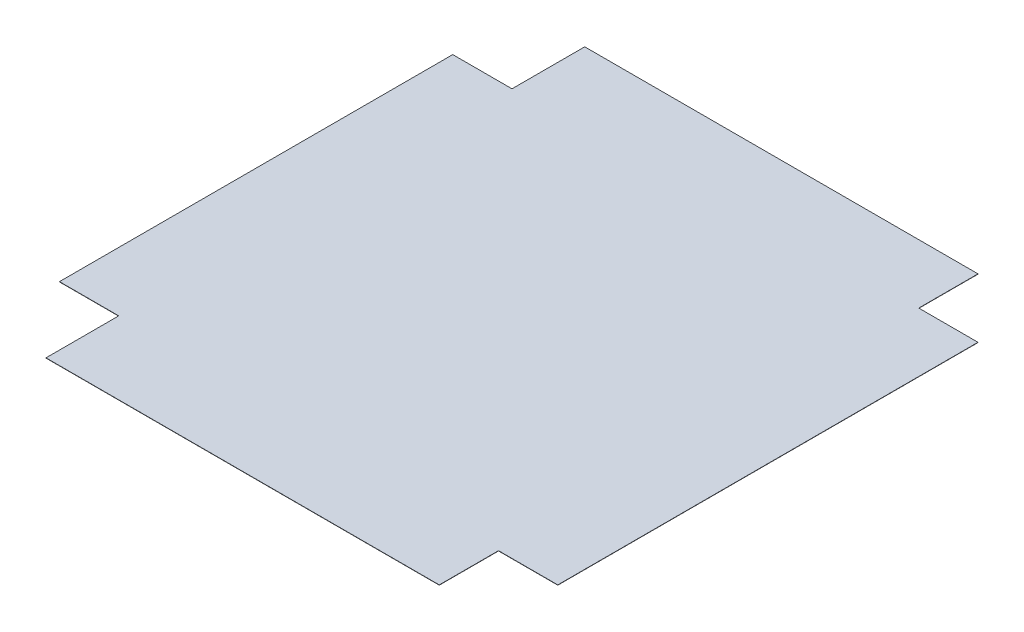
ISO-10303-21;
HEADER;
FILE_DESCRIPTION(('STEP AP214'),'2;1');
FILE_NAME('part.step','',(''),(''),'','','');
FILE_SCHEMA(('AUTOMOTIVE_DESIGN { 1 0 10303 214 1 1 1 1 }'));
ENDSEC;
DATA;
#1=APPLICATION_CONTEXT('core data for automotive mechanical design processes');
#2=APPLICATION_PROTOCOL_DEFINITION('international standard','automotive_design',2000,#1);
#3=PRODUCT_CONTEXT('',#1,'mechanical');
#4=PRODUCT('Part','Part','',(#3));
#5=PRODUCT_RELATED_PRODUCT_CATEGORY('part','',(#4));
#6=PRODUCT_DEFINITION_FORMATION('','',#4);
#7=PRODUCT_DEFINITION_CONTEXT('part definition',#1,'design');
#8=PRODUCT_DEFINITION('design','',#6,#7);
#9=PRODUCT_DEFINITION_SHAPE('','',#8);
#10=(LENGTH_UNIT() NAMED_UNIT(*) SI_UNIT(.MILLI.,.METRE.));
#11=(NAMED_UNIT(*) PLANE_ANGLE_UNIT() SI_UNIT($,.RADIAN.));
#12=(NAMED_UNIT(*) SI_UNIT($,.STERADIAN.) SOLID_ANGLE_UNIT());
#13=UNCERTAINTY_MEASURE_WITH_UNIT(LENGTH_MEASURE(1.E-05),#10,'distance_accuracy_value','');
#14=(GEOMETRIC_REPRESENTATION_CONTEXT(3) GLOBAL_UNCERTAINTY_ASSIGNED_CONTEXT((#13)) GLOBAL_UNIT_ASSIGNED_CONTEXT((#10,
#11,#12)) REPRESENTATION_CONTEXT('',''));
#15=CARTESIAN_POINT('',(0.,0.,0.));
#16=DIRECTION('',(0.,0.,1.));
#17=DIRECTION('',(1.,0.,0.));
#18=AXIS2_PLACEMENT_3D('',#15,#16,#17);
#19=CARTESIAN_POINT('',(-73.,0.05,-73.));
#20=DIRECTION('',(1.,0.,0.));
#21=DIRECTION('',(0.,0.,-1.));
#22=AXIS2_PLACEMENT_3D('',#19,#20,#21);
#23=PLANE('',#22);
#24=DIRECTION('',(0.,0.,1.));
#25=VECTOR('',#24,1.);
#26=CARTESIAN_POINT('',(-73.,-0.05,-73.));
#27=LINE('',#26,#25);
#28=CARTESIAN_POINT('',(-73.,-0.05,-100.));
#29=VERTEX_POINT('',#28);
#30=CARTESIAN_POINT('',(-73.,-0.05,-73.));
#31=VERTEX_POINT('',#30);
#32=EDGE_CURVE('E153',#29,#31,#27,.T.);
#33=ORIENTED_EDGE('',*,*,#32,.T.);
#34=DIRECTION('',(0.,-1.,0.));
#35=VECTOR('',#34,1.);
#36=CARTESIAN_POINT('',(-73.,0.05,-73.));
#37=LINE('',#36,#35);
#38=CARTESIAN_POINT('',(-73.,0.05,-73.));
#39=VERTEX_POINT('',#38);
#40=EDGE_CURVE('E11',#39,#31,#37,.T.);
#41=ORIENTED_EDGE('',*,*,#40,.F.);
#42=DIRECTION('',(0.,0.,1.));
#43=VECTOR('',#42,1.);
#44=CARTESIAN_POINT('',(-73.,0.05,-73.));
#45=LINE('',#44,#43);
#46=CARTESIAN_POINT('',(-73.,0.05,-100.));
#47=VERTEX_POINT('',#46);
#48=EDGE_CURVE('E175',#47,#39,#45,.T.);
#49=ORIENTED_EDGE('',*,*,#48,.F.);
#50=DIRECTION('',(0.,-1.,0.));
#51=VECTOR('',#50,1.);
#52=CARTESIAN_POINT('',(-73.,0.05,-100.));
#53=LINE('',#52,#51);
#54=EDGE_CURVE('E149',#47,#29,#53,.T.);
#55=ORIENTED_EDGE('',*,*,#54,.T.);
#56=EDGE_LOOP('',(#33,#41,#49,#55));
#57=FACE_BOUND('',#56,.T.);
#58=ADVANCED_FACE('F33',(#57),#23,.F.);
#59=CARTESIAN_POINT('',(-95.,0.05,-73.));
#60=DIRECTION('',(0.,0.,1.));
#61=DIRECTION('',(1.,0.,0.));
#62=AXIS2_PLACEMENT_3D('',#59,#60,#61);
#63=PLANE('',#62);
#64=DIRECTION('',(-1.,0.,0.));
#65=VECTOR('',#64,1.);
#66=CARTESIAN_POINT('',(-95.,-0.05,-73.));
#67=LINE('',#66,#65);
#68=CARTESIAN_POINT('',(-95.,-0.05,-73.));
#69=VERTEX_POINT('',#68);
#70=EDGE_CURVE('E156',#31,#69,#67,.T.);
#71=ORIENTED_EDGE('',*,*,#70,.T.);
#72=DIRECTION('',(0.,-1.,0.));
#73=VECTOR('',#72,1.);
#74=CARTESIAN_POINT('',(-95.,0.05,-73.));
#75=LINE('',#74,#73);
#76=CARTESIAN_POINT('',(-95.,0.05,-73.));
#77=VERTEX_POINT('',#76);
#78=EDGE_CURVE('E41',#77,#69,#75,.T.);
#79=ORIENTED_EDGE('',*,*,#78,.F.);
#80=DIRECTION('',(-1.,0.,0.));
#81=VECTOR('',#80,1.);
#82=CARTESIAN_POINT('',(-95.,0.05,-73.));
#83=LINE('',#82,#81);
#84=EDGE_CURVE('E104',#39,#77,#83,.T.);
#85=ORIENTED_EDGE('',*,*,#84,.F.);
#86=ORIENTED_EDGE('',*,*,#40,.T.);
#87=EDGE_LOOP('',(#71,#79,#85,#86));
#88=FACE_BOUND('',#87,.T.);
#89=ADVANCED_FACE('F253',(#88),#63,.F.);
#90=CARTESIAN_POINT('',(-95.,0.05,73.));
#91=DIRECTION('',(1.,0.,0.));
#92=DIRECTION('',(0.,0.,-1.));
#93=AXIS2_PLACEMENT_3D('',#90,#91,#92);
#94=PLANE('',#93);
#95=DIRECTION('',(0.,0.,1.));
#96=VECTOR('',#95,1.);
#97=CARTESIAN_POINT('',(-95.,-0.05,73.));
#98=LINE('',#97,#96);
#99=CARTESIAN_POINT('',(-95.,-0.05,73.));
#100=VERTEX_POINT('',#99);
#101=EDGE_CURVE('E158',#69,#100,#98,.T.);
#102=ORIENTED_EDGE('',*,*,#101,.T.);
#103=DIRECTION('',(0.,-1.,0.));
#104=VECTOR('',#103,1.);
#105=CARTESIAN_POINT('',(-95.,0.05,73.));
#106=LINE('',#105,#104);
#107=CARTESIAN_POINT('',(-95.,0.05,73.));
#108=VERTEX_POINT('',#107);
#109=EDGE_CURVE('E194',#108,#100,#106,.T.);
#110=ORIENTED_EDGE('',*,*,#109,.F.);
#111=DIRECTION('',(0.,0.,1.));
#112=VECTOR('',#111,1.);
#113=CARTESIAN_POINT('',(-95.,0.05,73.));
#114=LINE('',#113,#112);
#115=EDGE_CURVE('E202',#77,#108,#114,.T.);
#116=ORIENTED_EDGE('',*,*,#115,.F.);
#117=ORIENTED_EDGE('',*,*,#78,.T.);
#118=EDGE_LOOP('',(#102,#110,#116,#117));
#119=FACE_BOUND('',#118,.T.);
#120=ADVANCED_FACE('F200',(#119),#94,.F.);
#121=CARTESIAN_POINT('',(-73.,0.05,73.));
#122=DIRECTION('',(0.,0.,-1.));
#123=DIRECTION('',(-1.,0.,0.));
#124=AXIS2_PLACEMENT_3D('',#121,#122,#123);
#125=PLANE('',#124);
#126=DIRECTION('',(1.,0.,0.));
#127=VECTOR('',#126,1.);
#128=CARTESIAN_POINT('',(-73.,-0.05,73.));
#129=LINE('',#128,#127);
#130=CARTESIAN_POINT('',(-73.,-0.05,73.));
#131=VERTEX_POINT('',#130);
#132=EDGE_CURVE('E160',#100,#131,#129,.T.);
#133=ORIENTED_EDGE('',*,*,#132,.T.);
#134=DIRECTION('',(0.,-1.,0.));
#135=VECTOR('',#134,1.);
#136=CARTESIAN_POINT('',(-73.,0.05,73.));
#137=LINE('',#136,#135);
#138=CARTESIAN_POINT('',(-73.,0.05,73.));
#139=VERTEX_POINT('',#138);
#140=EDGE_CURVE('E191',#139,#131,#137,.T.);
#141=ORIENTED_EDGE('',*,*,#140,.F.);
#142=DIRECTION('',(1.,0.,0.));
#143=VECTOR('',#142,1.);
#144=CARTESIAN_POINT('',(-73.,0.05,73.));
#145=LINE('',#144,#143);
#146=EDGE_CURVE('E220',#108,#139,#145,.T.);
#147=ORIENTED_EDGE('',*,*,#146,.F.);
#148=ORIENTED_EDGE('',*,*,#109,.T.);
#149=EDGE_LOOP('',(#133,#141,#147,#148));
#150=FACE_BOUND('',#149,.T.);
#151=ADVANCED_FACE('F211',(#150),#125,.F.);
#152=CARTESIAN_POINT('',(-73.,0.05,100.));
#153=DIRECTION('',(1.,0.,0.));
#154=DIRECTION('',(0.,0.,-1.));
#155=AXIS2_PLACEMENT_3D('',#152,#153,#154);
#156=PLANE('',#155);
#157=DIRECTION('',(0.,0.,1.));
#158=VECTOR('',#157,1.);
#159=CARTESIAN_POINT('',(-73.,-0.05,100.));
#160=LINE('',#159,#158);
#161=CARTESIAN_POINT('',(-73.,-0.05,100.));
#162=VERTEX_POINT('',#161);
#163=EDGE_CURVE('E162',#131,#162,#160,.T.);
#164=ORIENTED_EDGE('',*,*,#163,.T.);
#165=DIRECTION('',(0.,-1.,0.));
#166=VECTOR('',#165,1.);
#167=CARTESIAN_POINT('',(-73.,0.05,100.));
#168=LINE('',#167,#166);
#169=CARTESIAN_POINT('',(-73.,0.05,100.));
#170=VERTEX_POINT('',#169);
#171=EDGE_CURVE('E188',#170,#162,#168,.T.);
#172=ORIENTED_EDGE('',*,*,#171,.F.);
#173=DIRECTION('',(0.,0.,1.));
#174=VECTOR('',#173,1.);
#175=CARTESIAN_POINT('',(-73.,0.05,100.));
#176=LINE('',#175,#174);
#177=EDGE_CURVE('E217',#139,#170,#176,.T.);
#178=ORIENTED_EDGE('',*,*,#177,.F.);
#179=ORIENTED_EDGE('',*,*,#140,.T.);
#180=EDGE_LOOP('',(#164,#172,#178,#179));
#181=FACE_BOUND('',#180,.T.);
#182=ADVANCED_FACE('F215',(#181),#156,.F.);
#183=CARTESIAN_POINT('',(73.,0.05,100.));
#184=DIRECTION('',(0.,0.,-1.));
#185=DIRECTION('',(-1.,0.,0.));
#186=AXIS2_PLACEMENT_3D('',#183,#184,#185);
#187=PLANE('',#186);
#188=DIRECTION('',(1.,0.,0.));
#189=VECTOR('',#188,1.);
#190=CARTESIAN_POINT('',(73.,-0.05,100.));
#191=LINE('',#190,#189);
#192=CARTESIAN_POINT('',(73.,-0.05,100.));
#193=VERTEX_POINT('',#192);
#194=EDGE_CURVE('E164',#162,#193,#191,.T.);
#195=ORIENTED_EDGE('',*,*,#194,.T.);
#196=DIRECTION('',(0.,-1.,0.));
#197=VECTOR('',#196,1.);
#198=CARTESIAN_POINT('',(73.,0.05,100.));
#199=LINE('',#198,#197);
#200=CARTESIAN_POINT('',(73.,0.05,100.));
#201=VERTEX_POINT('',#200);
#202=EDGE_CURVE('E185',#201,#193,#199,.T.);
#203=ORIENTED_EDGE('',*,*,#202,.F.);
#204=DIRECTION('',(1.,0.,0.));
#205=VECTOR('',#204,1.);
#206=CARTESIAN_POINT('',(73.,0.05,100.));
#207=LINE('',#206,#205);
#208=EDGE_CURVE('E219',#170,#201,#207,.T.);
#209=ORIENTED_EDGE('',*,*,#208,.F.);
#210=ORIENTED_EDGE('',*,*,#171,.T.);
#211=EDGE_LOOP('',(#195,#203,#209,#210));
#212=FACE_BOUND('',#211,.T.);
#213=ADVANCED_FACE('F266',(#212),#187,.F.);
#214=CARTESIAN_POINT('',(73.0000000000001,0.05,78.));
#215=DIRECTION('',(-1.,0.,0.));
#216=DIRECTION('',(0.,0.,1.));
#217=AXIS2_PLACEMENT_3D('',#214,#215,#216);
#218=PLANE('',#217);
#219=DIRECTION('',(0.,0.,-1.));
#220=VECTOR('',#219,1.);
#221=CARTESIAN_POINT('',(73.0000000000001,-0.05,78.));
#222=LINE('',#221,#220);
#223=CARTESIAN_POINT('',(73.0000000000001,-0.05,78.));
#224=VERTEX_POINT('',#223);
#225=EDGE_CURVE('E166',#193,#224,#222,.T.);
#226=ORIENTED_EDGE('',*,*,#225,.T.);
#227=DIRECTION('',(0.,-1.,0.));
#228=VECTOR('',#227,1.);
#229=CARTESIAN_POINT('',(73.0000000000001,0.05,78.));
#230=LINE('',#229,#228);
#231=CARTESIAN_POINT('',(73.0000000000001,0.05,78.));
#232=VERTEX_POINT('',#231);
#233=EDGE_CURVE('E182',#232,#224,#230,.T.);
#234=ORIENTED_EDGE('',*,*,#233,.F.);
#235=DIRECTION('',(0.,0.,-1.));
#236=VECTOR('',#235,1.);
#237=CARTESIAN_POINT('',(73.0000000000001,0.05,78.));
#238=LINE('',#237,#236);
#239=EDGE_CURVE('E222',#201,#232,#238,.T.);
#240=ORIENTED_EDGE('',*,*,#239,.F.);
#241=ORIENTED_EDGE('',*,*,#202,.T.);
#242=EDGE_LOOP('',(#226,#234,#240,#241));
#243=FACE_BOUND('',#242,.T.);
#244=ADVANCED_FACE('F269',(#243),#218,.F.);
#245=CARTESIAN_POINT('',(95.,0.05,78.));
#246=DIRECTION('',(0.,0.,-1.));
#247=DIRECTION('',(-1.,0.,0.));
#248=AXIS2_PLACEMENT_3D('',#245,#246,#247);
#249=PLANE('',#248);
#250=DIRECTION('',(1.,0.,0.));
#251=VECTOR('',#250,1.);
#252=CARTESIAN_POINT('',(95.,-0.05,78.));
#253=LINE('',#252,#251);
#254=CARTESIAN_POINT('',(95.,-0.05,78.));
#255=VERTEX_POINT('',#254);
#256=EDGE_CURVE('E168',#224,#255,#253,.T.);
#257=ORIENTED_EDGE('',*,*,#256,.T.);
#258=DIRECTION('',(0.,-1.,0.));
#259=VECTOR('',#258,1.);
#260=CARTESIAN_POINT('',(95.,0.05,78.));
#261=LINE('',#260,#259);
#262=CARTESIAN_POINT('',(95.,0.05,78.));
#263=VERTEX_POINT('',#262);
#264=EDGE_CURVE('E179',#263,#255,#261,.T.);
#265=ORIENTED_EDGE('',*,*,#264,.F.);
#266=DIRECTION('',(1.,0.,0.));
#267=VECTOR('',#266,1.);
#268=CARTESIAN_POINT('',(95.,0.05,78.));
#269=LINE('',#268,#267);
#270=EDGE_CURVE('E228',#232,#263,#269,.T.);
#271=ORIENTED_EDGE('',*,*,#270,.F.);
#272=ORIENTED_EDGE('',*,*,#233,.T.);
#273=EDGE_LOOP('',(#257,#265,#271,#272));
#274=FACE_BOUND('',#273,.T.);
#275=ADVANCED_FACE('F234',(#274),#249,.F.);
#276=CARTESIAN_POINT('',(95.,0.05,-78.));
#277=DIRECTION('',(-1.,0.,0.));
#278=DIRECTION('',(0.,0.,1.));
#279=AXIS2_PLACEMENT_3D('',#276,#277,#278);
#280=PLANE('',#279);
#281=DIRECTION('',(0.,0.,-1.));
#282=VECTOR('',#281,1.);
#283=CARTESIAN_POINT('',(95.,-0.05,-78.));
#284=LINE('',#283,#282);
#285=CARTESIAN_POINT('',(95.,-0.05,-78.));
#286=VERTEX_POINT('',#285);
#287=EDGE_CURVE('E170',#255,#286,#284,.T.);
#288=ORIENTED_EDGE('',*,*,#287,.T.);
#289=DIRECTION('',(0.,-1.,0.));
#290=VECTOR('',#289,1.);
#291=CARTESIAN_POINT('',(95.,0.05,-78.));
#292=LINE('',#291,#290);
#293=CARTESIAN_POINT('',(95.,0.05,-78.));
#294=VERTEX_POINT('',#293);
#295=EDGE_CURVE('E144',#294,#286,#292,.T.);
#296=ORIENTED_EDGE('',*,*,#295,.F.);
#297=DIRECTION('',(0.,0.,-1.));
#298=VECTOR('',#297,1.);
#299=CARTESIAN_POINT('',(95.,0.05,-78.));
#300=LINE('',#299,#298);
#301=EDGE_CURVE('E135',#263,#294,#300,.T.);
#302=ORIENTED_EDGE('',*,*,#301,.F.);
#303=ORIENTED_EDGE('',*,*,#264,.T.);
#304=EDGE_LOOP('',(#288,#296,#302,#303));
#305=FACE_BOUND('',#304,.T.);
#306=ADVANCED_FACE('F238',(#305),#280,.F.);
#307=CARTESIAN_POINT('',(73.,0.05,-78.));
#308=DIRECTION('',(0.,0.,1.));
#309=DIRECTION('',(1.,0.,0.));
#310=AXIS2_PLACEMENT_3D('',#307,#308,#309);
#311=PLANE('',#310);
#312=DIRECTION('',(-1.,0.,0.));
#313=VECTOR('',#312,1.);
#314=CARTESIAN_POINT('',(73.,-0.05,-78.));
#315=LINE('',#314,#313);
#316=CARTESIAN_POINT('',(73.,-0.05,-78.));
#317=VERTEX_POINT('',#316);
#318=EDGE_CURVE('E143',#286,#317,#315,.T.);
#319=ORIENTED_EDGE('',*,*,#318,.T.);
#320=DIRECTION('',(0.,-1.,0.));
#321=VECTOR('',#320,1.);
#322=CARTESIAN_POINT('',(73.,0.05,-78.));
#323=LINE('',#322,#321);
#324=CARTESIAN_POINT('',(73.,0.05,-78.));
#325=VERTEX_POINT('',#324);
#326=EDGE_CURVE('E140',#325,#317,#323,.T.);
#327=ORIENTED_EDGE('',*,*,#326,.F.);
#328=DIRECTION('',(-1.,0.,0.));
#329=VECTOR('',#328,1.);
#330=CARTESIAN_POINT('',(73.,0.05,-78.));
#331=LINE('',#330,#329);
#332=EDGE_CURVE('E129',#294,#325,#331,.T.);
#333=ORIENTED_EDGE('',*,*,#332,.F.);
#334=ORIENTED_EDGE('',*,*,#295,.T.);
#335=EDGE_LOOP('',(#319,#327,#333,#334));
#336=FACE_BOUND('',#335,.T.);
#337=ADVANCED_FACE('F141',(#336),#311,.F.);
#338=CARTESIAN_POINT('',(73.,0.05,-100.));
#339=DIRECTION('',(-1.,0.,0.));
#340=DIRECTION('',(0.,0.,1.));
#341=AXIS2_PLACEMENT_3D('',#338,#339,#340);
#342=PLANE('',#341);
#343=DIRECTION('',(0.,0.,-1.));
#344=VECTOR('',#343,1.);
#345=CARTESIAN_POINT('',(73.,-0.05,-100.));
#346=LINE('',#345,#344);
#347=CARTESIAN_POINT('',(73.,-0.05,-100.));
#348=VERTEX_POINT('',#347);
#349=EDGE_CURVE('E90',#317,#348,#346,.T.);
#350=ORIENTED_EDGE('',*,*,#349,.T.);
#351=DIRECTION('',(0.,-1.,0.));
#352=VECTOR('',#351,1.);
#353=CARTESIAN_POINT('',(73.,0.05,-100.));
#354=LINE('',#353,#352);
#355=CARTESIAN_POINT('',(73.,0.05,-100.));
#356=VERTEX_POINT('',#355);
#357=EDGE_CURVE('E145',#356,#348,#354,.T.);
#358=ORIENTED_EDGE('',*,*,#357,.F.);
#359=DIRECTION('',(0.,0.,-1.));
#360=VECTOR('',#359,1.);
#361=CARTESIAN_POINT('',(73.,0.05,-100.));
#362=LINE('',#361,#360);
#363=EDGE_CURVE('E133',#325,#356,#362,.T.);
#364=ORIENTED_EDGE('',*,*,#363,.F.);
#365=ORIENTED_EDGE('',*,*,#326,.T.);
#366=EDGE_LOOP('',(#350,#358,#364,#365));
#367=FACE_BOUND('',#366,.T.);
#368=ADVANCED_FACE('F147',(#367),#342,.F.);
#369=CARTESIAN_POINT('',(-73.,0.05,-100.));
#370=DIRECTION('',(0.,0.,1.));
#371=DIRECTION('',(1.,0.,0.));
#372=AXIS2_PLACEMENT_3D('',#369,#370,#371);
#373=PLANE('',#372);
#374=DIRECTION('',(-1.,0.,0.));
#375=VECTOR('',#374,1.);
#376=CARTESIAN_POINT('',(-73.,-0.05,-100.));
#377=LINE('',#376,#375);
#378=EDGE_CURVE('E96',#348,#29,#377,.T.);
#379=ORIENTED_EDGE('',*,*,#378,.T.);
#380=ORIENTED_EDGE('',*,*,#54,.F.);
#381=DIRECTION('',(-1.,0.,0.));
#382=VECTOR('',#381,1.);
#383=CARTESIAN_POINT('',(-73.,0.05,-100.));
#384=LINE('',#383,#382);
#385=EDGE_CURVE('E49',#356,#47,#384,.T.);
#386=ORIENTED_EDGE('',*,*,#385,.F.);
#387=ORIENTED_EDGE('',*,*,#357,.T.);
#388=EDGE_LOOP('',(#379,#380,#386,#387));
#389=FACE_BOUND('',#388,.T.);
#390=ADVANCED_FACE('F242',(#389),#373,.F.);
#391=CARTESIAN_POINT('',(0.,0.05,0.));
#392=DIRECTION('',(0.,-1.,0.));
#393=DIRECTION('',(0.,0.,-1.));
#394=AXIS2_PLACEMENT_3D('',#391,#392,#393);
#395=PLANE('',#394);
#396=ORIENTED_EDGE('',*,*,#48,.T.);
#397=ORIENTED_EDGE('',*,*,#84,.T.);
#398=ORIENTED_EDGE('',*,*,#115,.T.);
#399=ORIENTED_EDGE('',*,*,#146,.T.);
#400=ORIENTED_EDGE('',*,*,#177,.T.);
#401=ORIENTED_EDGE('',*,*,#208,.T.);
#402=ORIENTED_EDGE('',*,*,#239,.T.);
#403=ORIENTED_EDGE('',*,*,#270,.T.);
#404=ORIENTED_EDGE('',*,*,#301,.T.);
#405=ORIENTED_EDGE('',*,*,#332,.T.);
#406=ORIENTED_EDGE('',*,*,#363,.T.);
#407=ORIENTED_EDGE('',*,*,#385,.T.);
#408=EDGE_LOOP('',(#396,#397,#398,#399,#400,#401,#402,#403,#404,#405,#406,#407));
#409=FACE_BOUND('',#408,.T.);
#410=ADVANCED_FACE('F131',(#409),#395,.F.);
#411=CARTESIAN_POINT('',(0.,-0.05,0.));
#412=DIRECTION('',(0.,-1.,0.));
#413=DIRECTION('',(0.,0.,-1.));
#414=AXIS2_PLACEMENT_3D('',#411,#412,#413);
#415=PLANE('',#414);
#416=ORIENTED_EDGE('',*,*,#32,.F.);
#417=ORIENTED_EDGE('',*,*,#378,.F.);
#418=ORIENTED_EDGE('',*,*,#349,.F.);
#419=ORIENTED_EDGE('',*,*,#318,.F.);
#420=ORIENTED_EDGE('',*,*,#287,.F.);
#421=ORIENTED_EDGE('',*,*,#256,.F.);
#422=ORIENTED_EDGE('',*,*,#225,.F.);
#423=ORIENTED_EDGE('',*,*,#194,.F.);
#424=ORIENTED_EDGE('',*,*,#163,.F.);
#425=ORIENTED_EDGE('',*,*,#132,.F.);
#426=ORIENTED_EDGE('',*,*,#101,.F.);
#427=ORIENTED_EDGE('',*,*,#70,.F.);
#428=EDGE_LOOP('',(#416,#417,#418,#419,#420,#421,#422,#423,#424,#425,#426,#427));
#429=FACE_BOUND('',#428,.T.);
#430=ADVANCED_FACE('F206',(#429),#415,.T.);
#431=CLOSED_SHELL('',(#58,#89,#120,#151,#182,#213,#244,#275,#306,#337,#368,#390,#410,#430));
#432=MANIFOLD_SOLID_BREP('B2',#431);
#433=ADVANCED_BREP_SHAPE_REPRESENTATION('',(#18,#432),#14);
#434=SHAPE_DEFINITION_REPRESENTATION(#9,#433);
ENDSEC;
END-ISO-10303-21;
